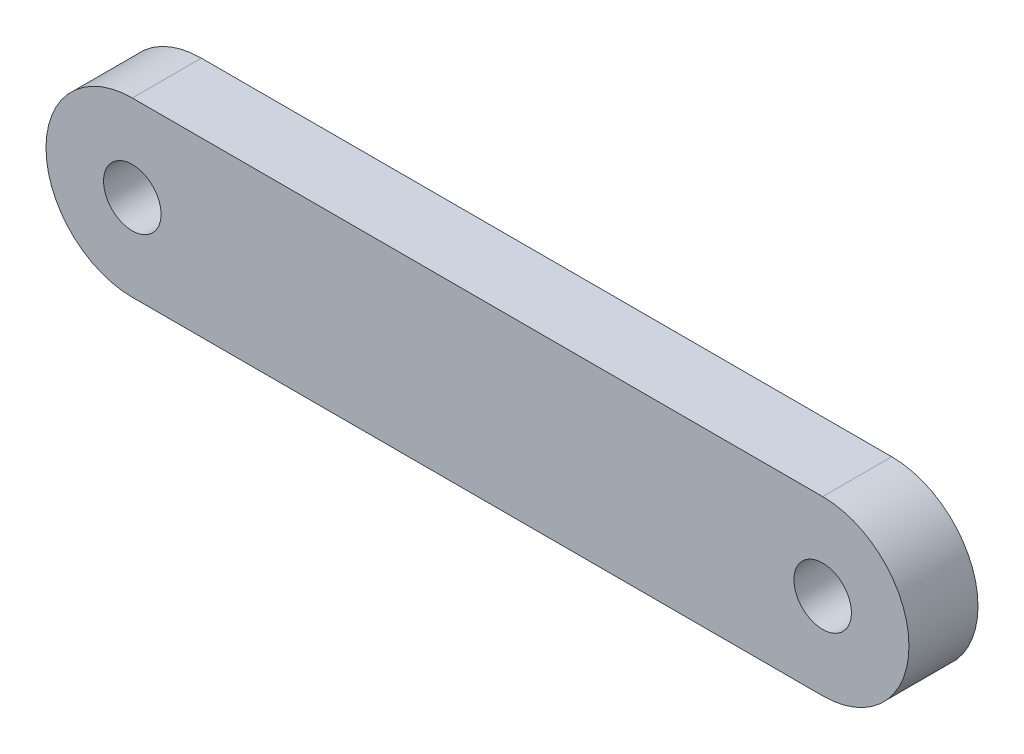
ISO-10303-21;
HEADER;
FILE_DESCRIPTION(('STEP AP214'),'2;1');
FILE_NAME('part.step','',(''),(''),'','','');
FILE_SCHEMA(('AUTOMOTIVE_DESIGN { 1 0 10303 214 1 1 1 1 }'));
ENDSEC;
DATA;
#1=APPLICATION_CONTEXT('core data for automotive mechanical design processes');
#2=APPLICATION_PROTOCOL_DEFINITION('international standard','automotive_design',2000,#1);
#3=PRODUCT_CONTEXT('',#1,'mechanical');
#4=PRODUCT('Part','Part','',(#3));
#5=PRODUCT_RELATED_PRODUCT_CATEGORY('part','',(#4));
#6=PRODUCT_DEFINITION_FORMATION('','',#4);
#7=PRODUCT_DEFINITION_CONTEXT('part definition',#1,'design');
#8=PRODUCT_DEFINITION('design','',#6,#7);
#9=PRODUCT_DEFINITION_SHAPE('','',#8);
#10=(LENGTH_UNIT() NAMED_UNIT(*) SI_UNIT(.MILLI.,.METRE.));
#11=(NAMED_UNIT(*) PLANE_ANGLE_UNIT() SI_UNIT($,.RADIAN.));
#12=(NAMED_UNIT(*) SI_UNIT($,.STERADIAN.) SOLID_ANGLE_UNIT());
#13=UNCERTAINTY_MEASURE_WITH_UNIT(LENGTH_MEASURE(1.E-05),#10,'distance_accuracy_value','');
#14=(GEOMETRIC_REPRESENTATION_CONTEXT(3) GLOBAL_UNCERTAINTY_ASSIGNED_CONTEXT((#13)) GLOBAL_UNIT_ASSIGNED_CONTEXT((#10,
#11,#12)) REPRESENTATION_CONTEXT('',''));
#15=CARTESIAN_POINT('',(0.,0.,0.));
#16=DIRECTION('',(0.,0.,1.));
#17=DIRECTION('',(1.,0.,0.));
#18=AXIS2_PLACEMENT_3D('',#15,#16,#17);
#19=CARTESIAN_POINT('',(0.,-7.49999999999999,3.));
#20=DIRECTION('',(0.,1.,0.));
#21=DIRECTION('',(-1.,0.,0.));
#22=AXIS2_PLACEMENT_3D('',#19,#20,#21);
#23=PLANE('',#22);
#24=DIRECTION('',(1.,0.,0.));
#25=VECTOR('',#24,1.);
#26=CARTESIAN_POINT('',(0.,-7.49999999999999,-3.));
#27=LINE('',#26,#25);
#28=CARTESIAN_POINT('',(-30.,-7.5,-3.));
#29=VERTEX_POINT('',#28);
#30=CARTESIAN_POINT('',(30.,-7.49999999999999,-3.));
#31=VERTEX_POINT('',#30);
#32=EDGE_CURVE('E110',#29,#31,#27,.T.);
#33=ORIENTED_EDGE('',*,*,#32,.T.);
#34=DIRECTION('',(0.,0.,-1.));
#35=VECTOR('',#34,1.);
#36=CARTESIAN_POINT('',(30.,-7.49999999999999,3.));
#37=LINE('',#36,#35);
#38=CARTESIAN_POINT('',(30.,-7.49999999999999,3.));
#39=VERTEX_POINT('',#38);
#40=EDGE_CURVE('E11',#39,#31,#37,.T.);
#41=ORIENTED_EDGE('',*,*,#40,.F.);
#42=DIRECTION('',(1.,0.,0.));
#43=VECTOR('',#42,1.);
#44=CARTESIAN_POINT('',(0.,-7.49999999999999,3.));
#45=LINE('',#44,#43);
#46=CARTESIAN_POINT('',(-30.,-7.5,3.));
#47=VERTEX_POINT('',#46);
#48=EDGE_CURVE('E89',#47,#39,#45,.T.);
#49=ORIENTED_EDGE('',*,*,#48,.F.);
#50=DIRECTION('',(0.,0.,-1.));
#51=VECTOR('',#50,1.);
#52=CARTESIAN_POINT('',(-30.,-7.5,3.));
#53=LINE('',#52,#51);
#54=EDGE_CURVE('E100',#47,#29,#53,.T.);
#55=ORIENTED_EDGE('',*,*,#54,.T.);
#56=EDGE_LOOP('',(#33,#41,#49,#55));
#57=FACE_BOUND('',#56,.T.);
#58=ADVANCED_FACE('F41',(#57),#23,.F.);
#59=CARTESIAN_POINT('',(30.,0.,3.));
#60=DIRECTION('',(0.,0.,-1.));
#61=DIRECTION('',(-1.,0.,0.));
#62=AXIS2_PLACEMENT_3D('',#59,#60,#61);
#63=CYLINDRICAL_SURFACE('',#62,7.5);
#64=CARTESIAN_POINT('',(30.,0.,-3.));
#65=DIRECTION('',(0.,0.,1.));
#66=DIRECTION('',(1.,0.,0.));
#67=AXIS2_PLACEMENT_3D('',#64,#65,#66);
#68=CIRCLE('',#67,7.5);
#69=CARTESIAN_POINT('',(30.,7.50000000000001,-3.));
#70=VERTEX_POINT('',#69);
#71=EDGE_CURVE('E94',#31,#70,#68,.T.);
#72=ORIENTED_EDGE('',*,*,#71,.T.);
#73=DIRECTION('',(0.,0.,-1.));
#74=VECTOR('',#73,1.);
#75=CARTESIAN_POINT('',(30.,7.50000000000001,3.));
#76=LINE('',#75,#74);
#77=CARTESIAN_POINT('',(30.,7.50000000000001,3.));
#78=VERTEX_POINT('',#77);
#79=EDGE_CURVE('E50',#78,#70,#76,.T.);
#80=ORIENTED_EDGE('',*,*,#79,.F.);
#81=CARTESIAN_POINT('',(30.,0.,3.));
#82=DIRECTION('',(0.,0.,1.));
#83=DIRECTION('',(1.,0.,0.));
#84=AXIS2_PLACEMENT_3D('',#81,#82,#83);
#85=CIRCLE('',#84,7.5);
#86=EDGE_CURVE('E84',#39,#78,#85,.T.);
#87=ORIENTED_EDGE('',*,*,#86,.F.);
#88=ORIENTED_EDGE('',*,*,#40,.T.);
#89=EDGE_LOOP('',(#72,#80,#87,#88));
#90=FACE_BOUND('',#89,.T.);
#91=ADVANCED_FACE('F93',(#90),#63,.T.);
#92=CARTESIAN_POINT('',(0.,7.50000000000001,3.));
#93=DIRECTION('',(0.,1.,0.));
#94=DIRECTION('',(-1.,0.,0.));
#95=AXIS2_PLACEMENT_3D('',#92,#93,#94);
#96=PLANE('',#95);
#97=DIRECTION('',(1.,0.,0.));
#98=VECTOR('',#97,1.);
#99=CARTESIAN_POINT('',(0.,7.50000000000001,-3.));
#100=LINE('',#99,#98);
#101=CARTESIAN_POINT('',(-30.,7.5,-3.));
#102=VERTEX_POINT('',#101);
#103=EDGE_CURVE('E114',#102,#70,#100,.T.);
#104=ORIENTED_EDGE('',*,*,#103,.F.);
#105=DIRECTION('',(0.,0.,-1.));
#106=VECTOR('',#105,1.);
#107=CARTESIAN_POINT('',(-30.,7.5,3.));
#108=LINE('',#107,#106);
#109=CARTESIAN_POINT('',(-30.,7.5,3.));
#110=VERTEX_POINT('',#109);
#111=EDGE_CURVE('E74',#110,#102,#108,.T.);
#112=ORIENTED_EDGE('',*,*,#111,.F.);
#113=DIRECTION('',(1.,0.,0.));
#114=VECTOR('',#113,1.);
#115=CARTESIAN_POINT('',(0.,7.50000000000001,3.));
#116=LINE('',#115,#114);
#117=EDGE_CURVE('E87',#110,#78,#116,.T.);
#118=ORIENTED_EDGE('',*,*,#117,.T.);
#119=ORIENTED_EDGE('',*,*,#79,.T.);
#120=EDGE_LOOP('',(#104,#112,#118,#119));
#121=FACE_BOUND('',#120,.T.);
#122=ADVANCED_FACE('F98',(#121),#96,.T.);
#123=CARTESIAN_POINT('',(-30.,0.,3.));
#124=DIRECTION('',(0.,0.,-1.));
#125=DIRECTION('',(-1.,0.,0.));
#126=AXIS2_PLACEMENT_3D('',#123,#124,#125);
#127=CYLINDRICAL_SURFACE('',#126,2.5);
#128=CARTESIAN_POINT('',(-30.,0.,3.));
#129=DIRECTION('',(0.,0.,1.));
#130=DIRECTION('',(1.,0.,0.));
#131=AXIS2_PLACEMENT_3D('',#128,#129,#130);
#132=CIRCLE('',#131,2.5);
#133=CARTESIAN_POINT('',(-27.5,0.,3.));
#134=VERTEX_POINT('',#133);
#135=EDGE_CURVE('E152',#134,#134,#132,.T.);
#136=ORIENTED_EDGE('',*,*,#135,.T.);
#137=EDGE_LOOP('',(#136));
#138=FACE_BOUND('',#137,.T.);
#139=CARTESIAN_POINT('',(-30.,0.,-3.));
#140=DIRECTION('',(0.,0.,1.));
#141=DIRECTION('',(1.,0.,0.));
#142=AXIS2_PLACEMENT_3D('',#139,#140,#141);
#143=CIRCLE('',#142,2.5);
#144=CARTESIAN_POINT('',(-27.5,0.,-3.));
#145=VERTEX_POINT('',#144);
#146=EDGE_CURVE('E107',#145,#145,#143,.T.);
#147=ORIENTED_EDGE('',*,*,#146,.F.);
#148=EDGE_LOOP('',(#147));
#149=FACE_BOUND('',#148,.T.);
#150=ADVANCED_FACE('F141',(#138,#149),#127,.F.);
#151=CARTESIAN_POINT('',(30.,0.,3.));
#152=DIRECTION('',(0.,0.,-1.));
#153=DIRECTION('',(-1.,0.,0.));
#154=AXIS2_PLACEMENT_3D('',#151,#152,#153);
#155=CYLINDRICAL_SURFACE('',#154,2.5);
#156=CARTESIAN_POINT('',(30.,0.,3.));
#157=DIRECTION('',(0.,0.,1.));
#158=DIRECTION('',(1.,0.,0.));
#159=AXIS2_PLACEMENT_3D('',#156,#157,#158);
#160=CIRCLE('',#159,2.5);
#161=CARTESIAN_POINT('',(32.5,0.,3.));
#162=VERTEX_POINT('',#161);
#163=EDGE_CURVE('E117',#162,#162,#160,.T.);
#164=ORIENTED_EDGE('',*,*,#163,.T.);
#165=EDGE_LOOP('',(#164));
#166=FACE_BOUND('',#165,.T.);
#167=CARTESIAN_POINT('',(30.,0.,-3.));
#168=DIRECTION('',(0.,0.,1.));
#169=DIRECTION('',(1.,0.,0.));
#170=AXIS2_PLACEMENT_3D('',#167,#168,#169);
#171=CIRCLE('',#170,2.5);
#172=CARTESIAN_POINT('',(32.5,0.,-3.));
#173=VERTEX_POINT('',#172);
#174=EDGE_CURVE('E104',#173,#173,#171,.T.);
#175=ORIENTED_EDGE('',*,*,#174,.F.);
#176=EDGE_LOOP('',(#175));
#177=FACE_BOUND('',#176,.T.);
#178=ADVANCED_FACE('F43',(#166,#177),#155,.F.);
#179=CARTESIAN_POINT('',(-30.,0.,3.));
#180=DIRECTION('',(0.,0.,-1.));
#181=DIRECTION('',(-1.,0.,0.));
#182=AXIS2_PLACEMENT_3D('',#179,#180,#181);
#183=CYLINDRICAL_SURFACE('',#182,7.5);
#184=CARTESIAN_POINT('',(-30.,0.,-3.));
#185=DIRECTION('',(0.,0.,1.));
#186=DIRECTION('',(1.,0.,0.));
#187=AXIS2_PLACEMENT_3D('',#184,#185,#186);
#188=CIRCLE('',#187,7.5);
#189=EDGE_CURVE('E77',#102,#29,#188,.T.);
#190=ORIENTED_EDGE('',*,*,#189,.T.);
#191=ORIENTED_EDGE('',*,*,#54,.F.);
#192=CARTESIAN_POINT('',(-30.,0.,3.));
#193=DIRECTION('',(0.,0.,1.));
#194=DIRECTION('',(1.,0.,0.));
#195=AXIS2_PLACEMENT_3D('',#192,#193,#194);
#196=CIRCLE('',#195,7.5);
#197=EDGE_CURVE('E58',#110,#47,#196,.T.);
#198=ORIENTED_EDGE('',*,*,#197,.F.);
#199=ORIENTED_EDGE('',*,*,#111,.T.);
#200=EDGE_LOOP('',(#190,#191,#198,#199));
#201=FACE_BOUND('',#200,.T.);
#202=ADVANCED_FACE('F129',(#201),#183,.T.);
#203=CARTESIAN_POINT('',(0.,0.,3.));
#204=DIRECTION('',(0.,0.,1.));
#205=DIRECTION('',(1.,0.,0.));
#206=AXIS2_PLACEMENT_3D('',#203,#204,#205);
#207=PLANE('',#206);
#208=ORIENTED_EDGE('',*,*,#163,.F.);
#209=EDGE_LOOP('',(#208));
#210=FACE_BOUND('',#209,.T.);
#211=ORIENTED_EDGE('',*,*,#135,.F.);
#212=EDGE_LOOP('',(#211));
#213=FACE_BOUND('',#212,.T.);
#214=ORIENTED_EDGE('',*,*,#48,.T.);
#215=ORIENTED_EDGE('',*,*,#86,.T.);
#216=ORIENTED_EDGE('',*,*,#117,.F.);
#217=ORIENTED_EDGE('',*,*,#197,.T.);
#218=EDGE_LOOP('',(#214,#215,#216,#217));
#219=FACE_BOUND('',#218,.T.);
#220=ADVANCED_FACE('F85',(#210,#213,#219),#207,.T.);
#221=CARTESIAN_POINT('',(0.,0.,-3.));
#222=DIRECTION('',(0.,0.,1.));
#223=DIRECTION('',(1.,0.,0.));
#224=AXIS2_PLACEMENT_3D('',#221,#222,#223);
#225=PLANE('',#224);
#226=ORIENTED_EDGE('',*,*,#174,.T.);
#227=EDGE_LOOP('',(#226));
#228=FACE_BOUND('',#227,.T.);
#229=ORIENTED_EDGE('',*,*,#146,.T.);
#230=EDGE_LOOP('',(#229));
#231=FACE_BOUND('',#230,.T.);
#232=ORIENTED_EDGE('',*,*,#32,.F.);
#233=ORIENTED_EDGE('',*,*,#189,.F.);
#234=ORIENTED_EDGE('',*,*,#103,.T.);
#235=ORIENTED_EDGE('',*,*,#71,.F.);
#236=EDGE_LOOP('',(#232,#233,#234,#235));
#237=FACE_BOUND('',#236,.T.);
#238=ADVANCED_FACE('F122',(#228,#231,#237),#225,.F.);
#239=CLOSED_SHELL('',(#58,#91,#122,#150,#178,#202,#220,#238));
#240=MANIFOLD_SOLID_BREP('B2',#239);
#241=ADVANCED_BREP_SHAPE_REPRESENTATION('',(#18,#240),#14);
#242=SHAPE_DEFINITION_REPRESENTATION(#9,#241);
ENDSEC;
END-ISO-10303-21;
